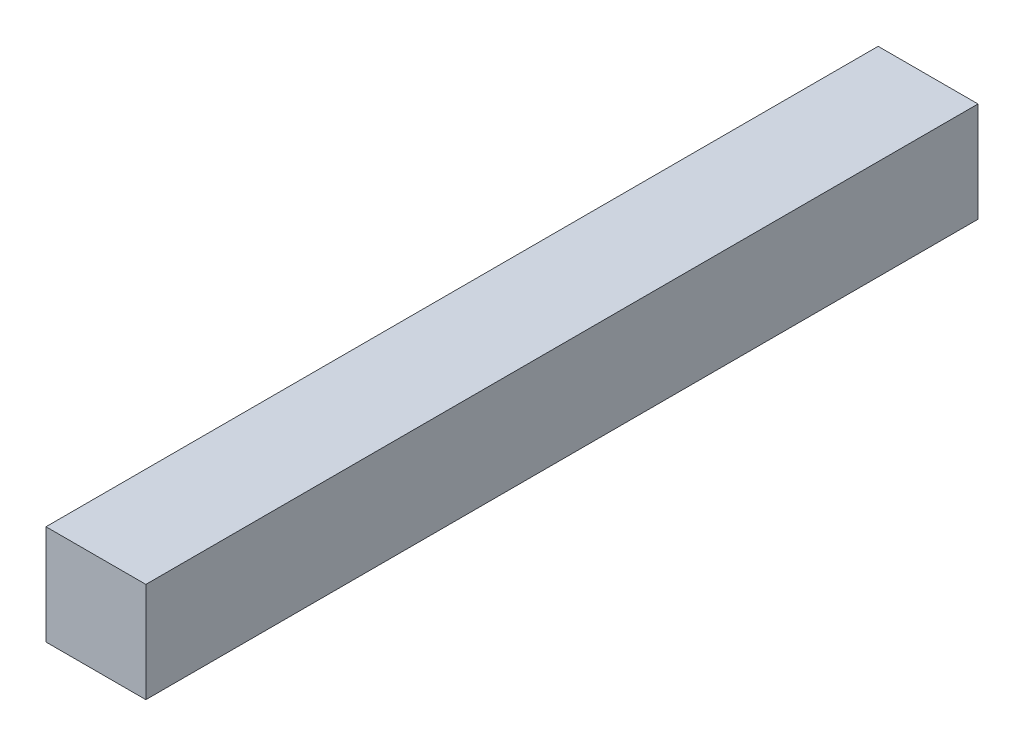
ISO-10303-21;
HEADER;
FILE_DESCRIPTION(('STEP AP214'),'2;1');
FILE_NAME('part.step','',(''),(''),'','','');
FILE_SCHEMA(('AUTOMOTIVE_DESIGN { 1 0 10303 214 1 1 1 1 }'));
ENDSEC;
DATA;
#1=APPLICATION_CONTEXT('core data for automotive mechanical design processes');
#2=APPLICATION_PROTOCOL_DEFINITION('international standard','automotive_design',2000,#1);
#3=PRODUCT_CONTEXT('',#1,'mechanical');
#4=PRODUCT('Part','Part','',(#3));
#5=PRODUCT_RELATED_PRODUCT_CATEGORY('part','',(#4));
#6=PRODUCT_DEFINITION_FORMATION('','',#4);
#7=PRODUCT_DEFINITION_CONTEXT('part definition',#1,'design');
#8=PRODUCT_DEFINITION('design','',#6,#7);
#9=PRODUCT_DEFINITION_SHAPE('','',#8);
#10=(LENGTH_UNIT() NAMED_UNIT(*) SI_UNIT(.MILLI.,.METRE.));
#11=(NAMED_UNIT(*) PLANE_ANGLE_UNIT() SI_UNIT($,.RADIAN.));
#12=(NAMED_UNIT(*) SI_UNIT($,.STERADIAN.) SOLID_ANGLE_UNIT());
#13=UNCERTAINTY_MEASURE_WITH_UNIT(LENGTH_MEASURE(1.E-05),#10,'distance_accuracy_value','');
#14=(GEOMETRIC_REPRESENTATION_CONTEXT(3) GLOBAL_UNCERTAINTY_ASSIGNED_CONTEXT((#13)) GLOBAL_UNIT_ASSIGNED_CONTEXT((#10,
#11,#12)) REPRESENTATION_CONTEXT('',''));
#15=CARTESIAN_POINT('',(0.,0.,0.));
#16=DIRECTION('',(0.,0.,1.));
#17=DIRECTION('',(1.,0.,0.));
#18=AXIS2_PLACEMENT_3D('',#15,#16,#17);
#19=CARTESIAN_POINT('',(-3.,-3.,50.));
#20=DIRECTION('',(1.,0.,0.));
#21=DIRECTION('',(0.,0.,-1.));
#22=AXIS2_PLACEMENT_3D('',#19,#20,#21);
#23=PLANE('',#22);
#24=DIRECTION('',(0.,-1.,0.));
#25=VECTOR('',#24,1.);
#26=CARTESIAN_POINT('',(-3.,-3.,0.));
#27=LINE('',#26,#25);
#28=CARTESIAN_POINT('',(-3.,3.,0.));
#29=VERTEX_POINT('',#28);
#30=CARTESIAN_POINT('',(-3.,-3.,0.));
#31=VERTEX_POINT('',#30);
#32=EDGE_CURVE('E97',#29,#31,#27,.T.);
#33=ORIENTED_EDGE('',*,*,#32,.T.);
#34=DIRECTION('',(0.,0.,-1.));
#35=VECTOR('',#34,1.);
#36=CARTESIAN_POINT('',(-3.,-3.,50.));
#37=LINE('',#36,#35);
#38=CARTESIAN_POINT('',(-3.,-3.,50.));
#39=VERTEX_POINT('',#38);
#40=EDGE_CURVE('E11',#39,#31,#37,.T.);
#41=ORIENTED_EDGE('',*,*,#40,.F.);
#42=DIRECTION('',(0.,-1.,0.));
#43=VECTOR('',#42,1.);
#44=CARTESIAN_POINT('',(-3.,-3.,50.));
#45=LINE('',#44,#43);
#46=CARTESIAN_POINT('',(-3.,3.,50.));
#47=VERTEX_POINT('',#46);
#48=EDGE_CURVE('E85',#47,#39,#45,.T.);
#49=ORIENTED_EDGE('',*,*,#48,.F.);
#50=DIRECTION('',(0.,0.,-1.));
#51=VECTOR('',#50,1.);
#52=CARTESIAN_POINT('',(-3.,3.,50.));
#53=LINE('',#52,#51);
#54=EDGE_CURVE('E93',#47,#29,#53,.T.);
#55=ORIENTED_EDGE('',*,*,#54,.T.);
#56=EDGE_LOOP('',(#33,#41,#49,#55));
#57=FACE_BOUND('',#56,.T.);
#58=ADVANCED_FACE('F34',(#57),#23,.F.);
#59=CARTESIAN_POINT('',(3.,-3.,50.));
#60=DIRECTION('',(0.,1.,0.));
#61=DIRECTION('',(-1.,0.,0.));
#62=AXIS2_PLACEMENT_3D('',#59,#60,#61);
#63=PLANE('',#62);
#64=DIRECTION('',(1.,0.,0.));
#65=VECTOR('',#64,1.);
#66=CARTESIAN_POINT('',(3.,-3.,0.));
#67=LINE('',#66,#65);
#68=CARTESIAN_POINT('',(3.,-3.,0.));
#69=VERTEX_POINT('',#68);
#70=EDGE_CURVE('E89',#31,#69,#67,.T.);
#71=ORIENTED_EDGE('',*,*,#70,.T.);
#72=DIRECTION('',(0.,0.,-1.));
#73=VECTOR('',#72,1.);
#74=CARTESIAN_POINT('',(3.,-3.,50.));
#75=LINE('',#74,#73);
#76=CARTESIAN_POINT('',(3.,-3.,50.));
#77=VERTEX_POINT('',#76);
#78=EDGE_CURVE('E42',#77,#69,#75,.T.);
#79=ORIENTED_EDGE('',*,*,#78,.F.);
#80=DIRECTION('',(1.,0.,0.));
#81=VECTOR('',#80,1.);
#82=CARTESIAN_POINT('',(3.,-3.,50.));
#83=LINE('',#82,#81);
#84=EDGE_CURVE('E80',#39,#77,#83,.T.);
#85=ORIENTED_EDGE('',*,*,#84,.F.);
#86=ORIENTED_EDGE('',*,*,#40,.T.);
#87=EDGE_LOOP('',(#71,#79,#85,#86));
#88=FACE_BOUND('',#87,.T.);
#89=ADVANCED_FACE('F88',(#88),#63,.F.);
#90=CARTESIAN_POINT('',(3.,-3.,50.));
#91=DIRECTION('',(-1.,0.,0.));
#92=DIRECTION('',(0.,0.,1.));
#93=AXIS2_PLACEMENT_3D('',#90,#91,#92);
#94=PLANE('',#93);
#95=DIRECTION('',(0.,1.,0.));
#96=VECTOR('',#95,1.);
#97=CARTESIAN_POINT('',(3.,-3.,0.));
#98=LINE('',#97,#96);
#99=CARTESIAN_POINT('',(3.,3.,0.));
#100=VERTEX_POINT('',#99);
#101=EDGE_CURVE('E67',#69,#100,#98,.T.);
#102=ORIENTED_EDGE('',*,*,#101,.T.);
#103=DIRECTION('',(0.,0.,-1.));
#104=VECTOR('',#103,1.);
#105=CARTESIAN_POINT('',(3.,3.,50.));
#106=LINE('',#105,#104);
#107=CARTESIAN_POINT('',(3.,3.,50.));
#108=VERTEX_POINT('',#107);
#109=EDGE_CURVE('E90',#108,#100,#106,.T.);
#110=ORIENTED_EDGE('',*,*,#109,.F.);
#111=DIRECTION('',(0.,1.,0.));
#112=VECTOR('',#111,1.);
#113=CARTESIAN_POINT('',(3.,-3.,50.));
#114=LINE('',#113,#112);
#115=EDGE_CURVE('E83',#77,#108,#114,.T.);
#116=ORIENTED_EDGE('',*,*,#115,.F.);
#117=ORIENTED_EDGE('',*,*,#78,.T.);
#118=EDGE_LOOP('',(#102,#110,#116,#117));
#119=FACE_BOUND('',#118,.T.);
#120=ADVANCED_FACE('F91',(#119),#94,.F.);
#121=CARTESIAN_POINT('',(3.,3.,50.));
#122=DIRECTION('',(0.,-1.,0.));
#123=DIRECTION('',(1.,0.,0.));
#124=AXIS2_PLACEMENT_3D('',#121,#122,#123);
#125=PLANE('',#124);
#126=DIRECTION('',(-1.,0.,0.));
#127=VECTOR('',#126,1.);
#128=CARTESIAN_POINT('',(3.,3.,0.));
#129=LINE('',#128,#127);
#130=EDGE_CURVE('E73',#100,#29,#129,.T.);
#131=ORIENTED_EDGE('',*,*,#130,.T.);
#132=ORIENTED_EDGE('',*,*,#54,.F.);
#133=DIRECTION('',(-1.,0.,0.));
#134=VECTOR('',#133,1.);
#135=CARTESIAN_POINT('',(3.,3.,50.));
#136=LINE('',#135,#134);
#137=EDGE_CURVE('E50',#108,#47,#136,.T.);
#138=ORIENTED_EDGE('',*,*,#137,.F.);
#139=ORIENTED_EDGE('',*,*,#109,.T.);
#140=EDGE_LOOP('',(#131,#132,#138,#139));
#141=FACE_BOUND('',#140,.T.);
#142=ADVANCED_FACE('F104',(#141),#125,.F.);
#143=CARTESIAN_POINT('',(0.,0.,50.));
#144=DIRECTION('',(0.,0.,1.));
#145=DIRECTION('',(1.,0.,0.));
#146=AXIS2_PLACEMENT_3D('',#143,#144,#145);
#147=PLANE('',#146);
#148=ORIENTED_EDGE('',*,*,#48,.T.);
#149=ORIENTED_EDGE('',*,*,#84,.T.);
#150=ORIENTED_EDGE('',*,*,#115,.T.);
#151=ORIENTED_EDGE('',*,*,#137,.T.);
#152=EDGE_LOOP('',(#148,#149,#150,#151));
#153=FACE_BOUND('',#152,.T.);
#154=ADVANCED_FACE('F81',(#153),#147,.T.);
#155=CARTESIAN_POINT('',(0.,0.,0.));
#156=DIRECTION('',(0.,0.,1.));
#157=DIRECTION('',(1.,0.,0.));
#158=AXIS2_PLACEMENT_3D('',#155,#156,#157);
#159=PLANE('',#158);
#160=ORIENTED_EDGE('',*,*,#32,.F.);
#161=ORIENTED_EDGE('',*,*,#130,.F.);
#162=ORIENTED_EDGE('',*,*,#101,.F.);
#163=ORIENTED_EDGE('',*,*,#70,.F.);
#164=EDGE_LOOP('',(#160,#161,#162,#163));
#165=FACE_BOUND('',#164,.T.);
#166=ADVANCED_FACE('F107',(#165),#159,.F.);
#167=CLOSED_SHELL('',(#58,#89,#120,#142,#154,#166));
#168=MANIFOLD_SOLID_BREP('B2',#167);
#169=ADVANCED_BREP_SHAPE_REPRESENTATION('',(#18,#168),#14);
#170=SHAPE_DEFINITION_REPRESENTATION(#9,#169);
ENDSEC;
END-ISO-10303-21;
